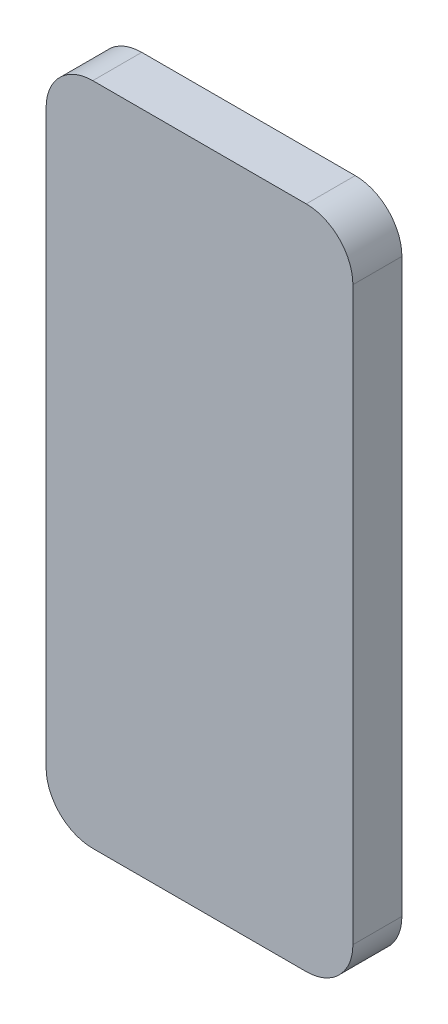
ISO-10303-21;
HEADER;
FILE_DESCRIPTION(('STEP AP214'),'2;1');
FILE_NAME('part.step','',(''),(''),'','','');
FILE_SCHEMA(('AUTOMOTIVE_DESIGN { 1 0 10303 214 1 1 1 1 }'));
ENDSEC;
DATA;
#1=APPLICATION_CONTEXT('core data for automotive mechanical design processes');
#2=APPLICATION_PROTOCOL_DEFINITION('international standard','automotive_design',2000,#1);
#3=PRODUCT_CONTEXT('',#1,'mechanical');
#4=PRODUCT('Part','Part','',(#3));
#5=PRODUCT_RELATED_PRODUCT_CATEGORY('part','',(#4));
#6=PRODUCT_DEFINITION_FORMATION('','',#4);
#7=PRODUCT_DEFINITION_CONTEXT('part definition',#1,'design');
#8=PRODUCT_DEFINITION('design','',#6,#7);
#9=PRODUCT_DEFINITION_SHAPE('','',#8);
#10=(LENGTH_UNIT() NAMED_UNIT(*) SI_UNIT(.MILLI.,.METRE.));
#11=(NAMED_UNIT(*) PLANE_ANGLE_UNIT() SI_UNIT($,.RADIAN.));
#12=(NAMED_UNIT(*) SI_UNIT($,.STERADIAN.) SOLID_ANGLE_UNIT());
#13=UNCERTAINTY_MEASURE_WITH_UNIT(LENGTH_MEASURE(1.E-05),#10,'distance_accuracy_value','');
#14=(GEOMETRIC_REPRESENTATION_CONTEXT(3) GLOBAL_UNCERTAINTY_ASSIGNED_CONTEXT((#13)) GLOBAL_UNIT_ASSIGNED_CONTEXT((#10,
#11,#12)) REPRESENTATION_CONTEXT('',''));
#15=CARTESIAN_POINT('',(0.,0.,0.));
#16=DIRECTION('',(0.,0.,1.));
#17=DIRECTION('',(1.,0.,0.));
#18=AXIS2_PLACEMENT_3D('',#15,#16,#17);
#19=CARTESIAN_POINT('',(19.725,42.75,6.3));
#20=DIRECTION('',(-1.,0.,0.));
#21=DIRECTION('',(0.,-1.,0.));
#22=AXIS2_PLACEMENT_3D('',#19,#20,#21);
#23=PLANE('',#22);
#24=DIRECTION('',(0.,1.,0.));
#25=VECTOR('',#24,1.);
#26=CARTESIAN_POINT('',(19.725,42.75,6.3));
#27=LINE('',#26,#25);
#28=CARTESIAN_POINT('',(19.725,-36.75,6.3));
#29=VERTEX_POINT('',#28);
#30=CARTESIAN_POINT('',(19.725,36.75,6.3));
#31=VERTEX_POINT('',#30);
#32=EDGE_CURVE('E127',#29,#31,#27,.T.);
#33=ORIENTED_EDGE('',*,*,#32,.F.);
#34=DIRECTION('',(0.,0.,-1.));
#35=VECTOR('',#34,1.);
#36=CARTESIAN_POINT('',(19.725,-36.75,6.3));
#37=LINE('',#36,#35);
#38=CARTESIAN_POINT('',(19.725,-36.75,0.));
#39=VERTEX_POINT('',#38);
#40=EDGE_CURVE('E111',#29,#39,#37,.T.);
#41=ORIENTED_EDGE('',*,*,#40,.T.);
#42=DIRECTION('',(0.,1.,0.));
#43=VECTOR('',#42,1.);
#44=CARTESIAN_POINT('',(19.725,42.75,0.));
#45=LINE('',#44,#43);
#46=CARTESIAN_POINT('',(19.725,36.75,0.));
#47=VERTEX_POINT('',#46);
#48=EDGE_CURVE('E124',#39,#47,#45,.T.);
#49=ORIENTED_EDGE('',*,*,#48,.T.);
#50=DIRECTION('',(0.,0.,-1.));
#51=VECTOR('',#50,1.);
#52=CARTESIAN_POINT('',(19.725,36.75,6.3));
#53=LINE('',#52,#51);
#54=EDGE_CURVE('E130',#47,#31,#53,.F.);
#55=ORIENTED_EDGE('',*,*,#54,.T.);
#56=EDGE_LOOP('',(#33,#41,#49,#55));
#57=FACE_BOUND('',#56,.T.);
#58=ADVANCED_FACE('F39',(#57),#23,.F.);
#59=CARTESIAN_POINT('',(-19.725,42.75,6.3));
#60=DIRECTION('',(0.,-1.,0.));
#61=DIRECTION('',(0.,0.,-1.));
#62=AXIS2_PLACEMENT_3D('',#59,#60,#61);
#63=PLANE('',#62);
#64=DIRECTION('',(-1.,0.,0.));
#65=VECTOR('',#64,1.);
#66=CARTESIAN_POINT('',(-19.725,42.75,0.));
#67=LINE('',#66,#65);
#68=CARTESIAN_POINT('',(13.725,42.75,0.));
#69=VERTEX_POINT('',#68);
#70=CARTESIAN_POINT('',(-13.725,42.75,0.));
#71=VERTEX_POINT('',#70);
#72=EDGE_CURVE('E135',#69,#71,#67,.T.);
#73=ORIENTED_EDGE('',*,*,#72,.T.);
#74=DIRECTION('',(0.,0.,-1.));
#75=VECTOR('',#74,1.);
#76=CARTESIAN_POINT('',(-13.725,42.75,6.3));
#77=LINE('',#76,#75);
#78=CARTESIAN_POINT('',(-13.725,42.75,6.3));
#79=VERTEX_POINT('',#78);
#80=EDGE_CURVE('E190',#71,#79,#77,.F.);
#81=ORIENTED_EDGE('',*,*,#80,.T.);
#82=DIRECTION('',(-1.,0.,0.));
#83=VECTOR('',#82,1.);
#84=CARTESIAN_POINT('',(-19.725,42.75,6.3));
#85=LINE('',#84,#83);
#86=CARTESIAN_POINT('',(13.725,42.75,6.3));
#87=VERTEX_POINT('',#86);
#88=EDGE_CURVE('E365',#87,#79,#85,.T.);
#89=ORIENTED_EDGE('',*,*,#88,.F.);
#90=DIRECTION('',(0.,0.,-1.));
#91=VECTOR('',#90,1.);
#92=CARTESIAN_POINT('',(13.725,42.75,6.3));
#93=LINE('',#92,#91);
#94=EDGE_CURVE('E186',#87,#69,#93,.T.);
#95=ORIENTED_EDGE('',*,*,#94,.T.);
#96=EDGE_LOOP('',(#73,#81,#89,#95));
#97=FACE_BOUND('',#96,.T.);
#98=ADVANCED_FACE('F334',(#97),#63,.F.);
#99=CARTESIAN_POINT('',(-19.725,42.75,6.3));
#100=DIRECTION('',(1.,0.,0.));
#101=DIRECTION('',(0.,1.,0.));
#102=AXIS2_PLACEMENT_3D('',#99,#100,#101);
#103=PLANE('',#102);
#104=DIRECTION('',(0.,-1.,0.));
#105=VECTOR('',#104,1.);
#106=CARTESIAN_POINT('',(-19.725,42.75,0.));
#107=LINE('',#106,#105);
#108=CARTESIAN_POINT('',(-19.725,36.75,0.));
#109=VERTEX_POINT('',#108);
#110=CARTESIAN_POINT('',(-19.725,-36.75,0.));
#111=VERTEX_POINT('',#110);
#112=EDGE_CURVE('E141',#109,#111,#107,.T.);
#113=ORIENTED_EDGE('',*,*,#112,.T.);
#114=DIRECTION('',(0.,0.,-1.));
#115=VECTOR('',#114,1.);
#116=CARTESIAN_POINT('',(-19.725,-36.75,6.3));
#117=LINE('',#116,#115);
#118=CARTESIAN_POINT('',(-19.725,-36.75,6.3));
#119=VERTEX_POINT('',#118);
#120=EDGE_CURVE('E55',#111,#119,#117,.F.);
#121=ORIENTED_EDGE('',*,*,#120,.T.);
#122=DIRECTION('',(0.,-1.,0.));
#123=VECTOR('',#122,1.);
#124=CARTESIAN_POINT('',(-19.725,42.75,6.3));
#125=LINE('',#124,#123);
#126=CARTESIAN_POINT('',(-19.725,36.75,6.3));
#127=VERTEX_POINT('',#126);
#128=EDGE_CURVE('E356',#127,#119,#125,.T.);
#129=ORIENTED_EDGE('',*,*,#128,.F.);
#130=DIRECTION('',(0.,0.,-1.));
#131=VECTOR('',#130,1.);
#132=CARTESIAN_POINT('',(-19.725,36.75,6.3));
#133=LINE('',#132,#131);
#134=EDGE_CURVE('E180',#127,#109,#133,.T.);
#135=ORIENTED_EDGE('',*,*,#134,.T.);
#136=EDGE_LOOP('',(#113,#121,#129,#135));
#137=FACE_BOUND('',#136,.T.);
#138=ADVANCED_FACE('F339',(#137),#103,.F.);
#139=CARTESIAN_POINT('',(-19.725,-42.75,6.3));
#140=DIRECTION('',(0.,1.,0.));
#141=DIRECTION('',(0.,0.,1.));
#142=AXIS2_PLACEMENT_3D('',#139,#140,#141);
#143=PLANE('',#142);
#144=DIRECTION('',(1.,0.,0.));
#145=VECTOR('',#144,1.);
#146=CARTESIAN_POINT('',(-19.725,-42.75,0.));
#147=LINE('',#146,#145);
#148=CARTESIAN_POINT('',(-13.725,-42.75,0.));
#149=VERTEX_POINT('',#148);
#150=CARTESIAN_POINT('',(13.725,-42.75,0.));
#151=VERTEX_POINT('',#150);
#152=EDGE_CURVE('E152',#149,#151,#147,.T.);
#153=ORIENTED_EDGE('',*,*,#152,.T.);
#154=DIRECTION('',(0.,0.,-1.));
#155=VECTOR('',#154,1.);
#156=CARTESIAN_POINT('',(13.725,-42.75,6.3));
#157=LINE('',#156,#155);
#158=CARTESIAN_POINT('',(13.725,-42.75,6.3));
#159=VERTEX_POINT('',#158);
#160=EDGE_CURVE('E112',#151,#159,#157,.F.);
#161=ORIENTED_EDGE('',*,*,#160,.T.);
#162=DIRECTION('',(1.,0.,0.));
#163=VECTOR('',#162,1.);
#164=CARTESIAN_POINT('',(-19.725,-42.75,6.3));
#165=LINE('',#164,#163);
#166=CARTESIAN_POINT('',(-13.725,-42.75,6.3));
#167=VERTEX_POINT('',#166);
#168=EDGE_CURVE('E147',#167,#159,#165,.T.);
#169=ORIENTED_EDGE('',*,*,#168,.F.);
#170=DIRECTION('',(0.,0.,-1.));
#171=VECTOR('',#170,1.);
#172=CARTESIAN_POINT('',(-13.725,-42.75,6.3));
#173=LINE('',#172,#171);
#174=EDGE_CURVE('E118',#167,#149,#173,.T.);
#175=ORIENTED_EDGE('',*,*,#174,.T.);
#176=EDGE_LOOP('',(#153,#161,#169,#175));
#177=FACE_BOUND('',#176,.T.);
#178=ADVANCED_FACE('F361',(#177),#143,.F.);
#179=CARTESIAN_POINT('',(0.,0.,6.3));
#180=DIRECTION('',(0.,0.,1.));
#181=DIRECTION('',(1.,0.,0.));
#182=AXIS2_PLACEMENT_3D('',#179,#180,#181);
#183=PLANE('',#182);
#184=ORIENTED_EDGE('',*,*,#168,.T.);
#185=CARTESIAN_POINT('',(13.725,-36.75,6.3));
#186=DIRECTION('',(0.,0.,1.));
#187=DIRECTION('',(1.,0.,0.));
#188=AXIS2_PLACEMENT_3D('',#185,#186,#187);
#189=CIRCLE('',#188,6.);
#190=EDGE_CURVE('E177',#159,#29,#189,.T.);
#191=ORIENTED_EDGE('',*,*,#190,.T.);
#192=ORIENTED_EDGE('',*,*,#32,.T.);
#193=CARTESIAN_POINT('',(13.725,36.75,6.3));
#194=DIRECTION('',(0.,0.,1.));
#195=DIRECTION('',(1.,0.,0.));
#196=AXIS2_PLACEMENT_3D('',#193,#194,#195);
#197=CIRCLE('',#196,6.);
#198=EDGE_CURVE('E169',#31,#87,#197,.T.);
#199=ORIENTED_EDGE('',*,*,#198,.T.);
#200=ORIENTED_EDGE('',*,*,#88,.T.);
#201=CARTESIAN_POINT('',(-13.725,36.75,6.3));
#202=DIRECTION('',(0.,0.,1.));
#203=DIRECTION('',(1.,0.,0.));
#204=AXIS2_PLACEMENT_3D('',#201,#202,#203);
#205=CIRCLE('',#204,6.);
#206=EDGE_CURVE('E62',#79,#127,#205,.T.);
#207=ORIENTED_EDGE('',*,*,#206,.T.);
#208=ORIENTED_EDGE('',*,*,#128,.T.);
#209=CARTESIAN_POINT('',(-13.725,-36.75,6.3));
#210=DIRECTION('',(0.,0.,1.));
#211=DIRECTION('',(1.,0.,0.));
#212=AXIS2_PLACEMENT_3D('',#209,#210,#211);
#213=CIRCLE('',#212,6.);
#214=EDGE_CURVE('E174',#119,#167,#213,.T.);
#215=ORIENTED_EDGE('',*,*,#214,.T.);
#216=EDGE_LOOP('',(#184,#191,#192,#199,#200,#207,#208,#215));
#217=FACE_BOUND('',#216,.T.);
#218=ADVANCED_FACE('F276',(#217),#183,.T.);
#219=CARTESIAN_POINT('',(0.,0.,0.));
#220=DIRECTION('',(0.,0.,1.));
#221=DIRECTION('',(1.,0.,0.));
#222=AXIS2_PLACEMENT_3D('',#219,#220,#221);
#223=PLANE('',#222);
#224=CARTESIAN_POINT('',(0.,-27.75,0.));
#225=DIRECTION('',(0.,0.,1.));
#226=DIRECTION('',(1.,0.,0.));
#227=AXIS2_PLACEMENT_3D('',#224,#225,#226);
#228=CIRCLE('',#227,4.25);
#229=CARTESIAN_POINT('',(4.25000000000001,-27.75,0.));
#230=VERTEX_POINT('',#229);
#231=EDGE_CURVE('E11',#230,#230,#228,.F.);
#232=ORIENTED_EDGE('',*,*,#231,.F.);
#233=EDGE_LOOP('',(#232));
#234=FACE_BOUND('',#233,.T.);
#235=CARTESIAN_POINT('',(-11.225,-27.75,0.));
#236=DIRECTION('',(0.,0.,1.));
#237=DIRECTION('',(1.,0.,0.));
#238=AXIS2_PLACEMENT_3D('',#235,#236,#237);
#239=CIRCLE('',#238,4.25);
#240=CARTESIAN_POINT('',(-6.975,-27.75,0.));
#241=VERTEX_POINT('',#240);
#242=EDGE_CURVE('E48',#241,#241,#239,.F.);
#243=ORIENTED_EDGE('',*,*,#242,.F.);
#244=EDGE_LOOP('',(#243));
#245=FACE_BOUND('',#244,.T.);
#246=CARTESIAN_POINT('',(11.225,-27.75,0.));
#247=DIRECTION('',(0.,0.,1.));
#248=DIRECTION('',(1.,0.,0.));
#249=AXIS2_PLACEMENT_3D('',#246,#247,#248);
#250=CIRCLE('',#249,4.25);
#251=CARTESIAN_POINT('',(15.475,-27.75,0.));
#252=VERTEX_POINT('',#251);
#253=EDGE_CURVE('E265',#252,#252,#250,.F.);
#254=ORIENTED_EDGE('',*,*,#253,.F.);
#255=EDGE_LOOP('',(#254));
#256=FACE_BOUND('',#255,.T.);
#257=CARTESIAN_POINT('',(0.,-17.75,0.));
#258=DIRECTION('',(0.,0.,1.));
#259=DIRECTION('',(1.,0.,0.));
#260=AXIS2_PLACEMENT_3D('',#257,#258,#259);
#261=CIRCLE('',#260,4.25);
#262=CARTESIAN_POINT('',(4.25000000000001,-17.75,0.));
#263=VERTEX_POINT('',#262);
#264=EDGE_CURVE('E261',#263,#263,#261,.F.);
#265=ORIENTED_EDGE('',*,*,#264,.F.);
#266=EDGE_LOOP('',(#265));
#267=FACE_BOUND('',#266,.T.);
#268=CARTESIAN_POINT('',(-11.225,-17.75,0.));
#269=DIRECTION('',(0.,0.,1.));
#270=DIRECTION('',(1.,0.,0.));
#271=AXIS2_PLACEMENT_3D('',#268,#269,#270);
#272=CIRCLE('',#271,4.25);
#273=CARTESIAN_POINT('',(-6.975,-17.75,0.));
#274=VERTEX_POINT('',#273);
#275=EDGE_CURVE('E257',#274,#274,#272,.F.);
#276=ORIENTED_EDGE('',*,*,#275,.F.);
#277=EDGE_LOOP('',(#276));
#278=FACE_BOUND('',#277,.T.);
#279=CARTESIAN_POINT('',(11.225,-17.75,0.));
#280=DIRECTION('',(0.,0.,1.));
#281=DIRECTION('',(1.,0.,0.));
#282=AXIS2_PLACEMENT_3D('',#279,#280,#281);
#283=CIRCLE('',#282,4.25);
#284=CARTESIAN_POINT('',(15.475,-17.75,0.));
#285=VERTEX_POINT('',#284);
#286=EDGE_CURVE('E253',#285,#285,#283,.F.);
#287=ORIENTED_EDGE('',*,*,#286,.F.);
#288=EDGE_LOOP('',(#287));
#289=FACE_BOUND('',#288,.T.);
#290=CARTESIAN_POINT('',(0.,-7.75000000000005,0.));
#291=DIRECTION('',(0.,0.,1.));
#292=DIRECTION('',(1.,0.,0.));
#293=AXIS2_PLACEMENT_3D('',#290,#291,#292);
#294=CIRCLE('',#293,4.25);
#295=CARTESIAN_POINT('',(4.25000000000001,-7.75000000000005,0.));
#296=VERTEX_POINT('',#295);
#297=EDGE_CURVE('E249',#296,#296,#294,.F.);
#298=ORIENTED_EDGE('',*,*,#297,.F.);
#299=EDGE_LOOP('',(#298));
#300=FACE_BOUND('',#299,.T.);
#301=CARTESIAN_POINT('',(-11.225,-7.75,0.));
#302=DIRECTION('',(0.,0.,1.));
#303=DIRECTION('',(1.,0.,0.));
#304=AXIS2_PLACEMENT_3D('',#301,#302,#303);
#305=CIRCLE('',#304,4.25);
#306=CARTESIAN_POINT('',(-6.975,-7.75,0.));
#307=VERTEX_POINT('',#306);
#308=EDGE_CURVE('E245',#307,#307,#305,.F.);
#309=ORIENTED_EDGE('',*,*,#308,.F.);
#310=EDGE_LOOP('',(#309));
#311=FACE_BOUND('',#310,.T.);
#312=CARTESIAN_POINT('',(11.225,-7.75,0.));
#313=DIRECTION('',(0.,0.,1.));
#314=DIRECTION('',(1.,0.,0.));
#315=AXIS2_PLACEMENT_3D('',#312,#313,#314);
#316=CIRCLE('',#315,4.25);
#317=CARTESIAN_POINT('',(15.475,-7.75,0.));
#318=VERTEX_POINT('',#317);
#319=EDGE_CURVE('E241',#318,#318,#316,.F.);
#320=ORIENTED_EDGE('',*,*,#319,.F.);
#321=EDGE_LOOP('',(#320));
#322=FACE_BOUND('',#321,.T.);
#323=CARTESIAN_POINT('',(0.,2.24999999999995,0.));
#324=DIRECTION('',(0.,0.,1.));
#325=DIRECTION('',(1.,0.,0.));
#326=AXIS2_PLACEMENT_3D('',#323,#324,#325);
#327=CIRCLE('',#326,4.25);
#328=CARTESIAN_POINT('',(4.25000000000001,2.24999999999995,0.));
#329=VERTEX_POINT('',#328);
#330=EDGE_CURVE('E237',#329,#329,#327,.F.);
#331=ORIENTED_EDGE('',*,*,#330,.F.);
#332=EDGE_LOOP('',(#331));
#333=FACE_BOUND('',#332,.T.);
#334=CARTESIAN_POINT('',(-11.225,2.25,0.));
#335=DIRECTION('',(0.,0.,1.));
#336=DIRECTION('',(1.,0.,0.));
#337=AXIS2_PLACEMENT_3D('',#334,#335,#336);
#338=CIRCLE('',#337,4.25);
#339=CARTESIAN_POINT('',(-6.975,2.25,0.));
#340=VERTEX_POINT('',#339);
#341=EDGE_CURVE('E233',#340,#340,#338,.F.);
#342=ORIENTED_EDGE('',*,*,#341,.F.);
#343=EDGE_LOOP('',(#342));
#344=FACE_BOUND('',#343,.T.);
#345=CARTESIAN_POINT('',(11.225,2.25,0.));
#346=DIRECTION('',(0.,0.,1.));
#347=DIRECTION('',(1.,0.,0.));
#348=AXIS2_PLACEMENT_3D('',#345,#346,#347);
#349=CIRCLE('',#348,4.25);
#350=CARTESIAN_POINT('',(15.475,2.25,0.));
#351=VERTEX_POINT('',#350);
#352=EDGE_CURVE('E229',#351,#351,#349,.F.);
#353=ORIENTED_EDGE('',*,*,#352,.F.);
#354=EDGE_LOOP('',(#353));
#355=FACE_BOUND('',#354,.T.);
#356=CARTESIAN_POINT('',(0.,12.25,0.));
#357=DIRECTION('',(0.,0.,1.));
#358=DIRECTION('',(1.,0.,0.));
#359=AXIS2_PLACEMENT_3D('',#356,#357,#358);
#360=CIRCLE('',#359,4.25);
#361=CARTESIAN_POINT('',(4.25,12.25,0.));
#362=VERTEX_POINT('',#361);
#363=EDGE_CURVE('E225',#362,#362,#360,.F.);
#364=ORIENTED_EDGE('',*,*,#363,.F.);
#365=EDGE_LOOP('',(#364));
#366=FACE_BOUND('',#365,.T.);
#367=CARTESIAN_POINT('',(-11.225,12.25,0.));
#368=DIRECTION('',(0.,0.,1.));
#369=DIRECTION('',(1.,0.,0.));
#370=AXIS2_PLACEMENT_3D('',#367,#368,#369);
#371=CIRCLE('',#370,4.25);
#372=CARTESIAN_POINT('',(-6.975,12.25,0.));
#373=VERTEX_POINT('',#372);
#374=EDGE_CURVE('E221',#373,#373,#371,.F.);
#375=ORIENTED_EDGE('',*,*,#374,.F.);
#376=EDGE_LOOP('',(#375));
#377=FACE_BOUND('',#376,.T.);
#378=CARTESIAN_POINT('',(11.225,12.25,0.));
#379=DIRECTION('',(0.,0.,1.));
#380=DIRECTION('',(1.,0.,0.));
#381=AXIS2_PLACEMENT_3D('',#378,#379,#380);
#382=CIRCLE('',#381,4.25);
#383=CARTESIAN_POINT('',(15.475,12.25,0.));
#384=VERTEX_POINT('',#383);
#385=EDGE_CURVE('E217',#384,#384,#382,.F.);
#386=ORIENTED_EDGE('',*,*,#385,.F.);
#387=EDGE_LOOP('',(#386));
#388=FACE_BOUND('',#387,.T.);
#389=CARTESIAN_POINT('',(0.,22.25,0.));
#390=DIRECTION('',(0.,0.,1.));
#391=DIRECTION('',(1.,0.,0.));
#392=AXIS2_PLACEMENT_3D('',#389,#390,#391);
#393=CIRCLE('',#392,4.25);
#394=CARTESIAN_POINT('',(4.25,22.25,0.));
#395=VERTEX_POINT('',#394);
#396=EDGE_CURVE('E213',#395,#395,#393,.F.);
#397=ORIENTED_EDGE('',*,*,#396,.F.);
#398=EDGE_LOOP('',(#397));
#399=FACE_BOUND('',#398,.T.);
#400=CARTESIAN_POINT('',(-11.225,22.25,0.));
#401=DIRECTION('',(0.,0.,1.));
#402=DIRECTION('',(1.,0.,0.));
#403=AXIS2_PLACEMENT_3D('',#400,#401,#402);
#404=CIRCLE('',#403,4.25);
#405=CARTESIAN_POINT('',(-6.97500000000001,22.25,0.));
#406=VERTEX_POINT('',#405);
#407=EDGE_CURVE('E209',#406,#406,#404,.F.);
#408=ORIENTED_EDGE('',*,*,#407,.F.);
#409=EDGE_LOOP('',(#408));
#410=FACE_BOUND('',#409,.T.);
#411=CARTESIAN_POINT('',(11.225,22.25,0.));
#412=DIRECTION('',(0.,0.,1.));
#413=DIRECTION('',(1.,0.,0.));
#414=AXIS2_PLACEMENT_3D('',#411,#412,#413);
#415=CIRCLE('',#414,4.25);
#416=CARTESIAN_POINT('',(15.475,22.25,0.));
#417=VERTEX_POINT('',#416);
#418=EDGE_CURVE('E205',#417,#417,#415,.F.);
#419=ORIENTED_EDGE('',*,*,#418,.F.);
#420=EDGE_LOOP('',(#419));
#421=FACE_BOUND('',#420,.T.);
#422=CARTESIAN_POINT('',(0.,32.25,0.));
#423=DIRECTION('',(0.,0.,1.));
#424=DIRECTION('',(1.,0.,0.));
#425=AXIS2_PLACEMENT_3D('',#422,#423,#424);
#426=CIRCLE('',#425,4.25);
#427=CARTESIAN_POINT('',(4.25,32.25,0.));
#428=VERTEX_POINT('',#427);
#429=EDGE_CURVE('E201',#428,#428,#426,.F.);
#430=ORIENTED_EDGE('',*,*,#429,.F.);
#431=EDGE_LOOP('',(#430));
#432=FACE_BOUND('',#431,.T.);
#433=CARTESIAN_POINT('',(-11.225,32.25,0.));
#434=DIRECTION('',(0.,0.,1.));
#435=DIRECTION('',(1.,0.,0.));
#436=AXIS2_PLACEMENT_3D('',#433,#434,#435);
#437=CIRCLE('',#436,4.25);
#438=CARTESIAN_POINT('',(-6.97500000000001,32.25,0.));
#439=VERTEX_POINT('',#438);
#440=EDGE_CURVE('E197',#439,#439,#437,.F.);
#441=ORIENTED_EDGE('',*,*,#440,.F.);
#442=EDGE_LOOP('',(#441));
#443=FACE_BOUND('',#442,.T.);
#444=CARTESIAN_POINT('',(11.225,32.25,0.));
#445=DIRECTION('',(0.,0.,1.));
#446=DIRECTION('',(1.,0.,0.));
#447=AXIS2_PLACEMENT_3D('',#444,#445,#446);
#448=CIRCLE('',#447,4.25);
#449=CARTESIAN_POINT('',(15.475,32.25,0.));
#450=VERTEX_POINT('',#449);
#451=EDGE_CURVE('E193',#450,#450,#448,.F.);
#452=ORIENTED_EDGE('',*,*,#451,.F.);
#453=EDGE_LOOP('',(#452));
#454=FACE_BOUND('',#453,.T.);
#455=ORIENTED_EDGE('',*,*,#48,.F.);
#456=CARTESIAN_POINT('',(13.725,-36.75,0.));
#457=DIRECTION('',(0.,0.,1.));
#458=DIRECTION('',(1.,0.,0.));
#459=AXIS2_PLACEMENT_3D('',#456,#457,#458);
#460=CIRCLE('',#459,6.);
#461=EDGE_CURVE('E107',#39,#151,#460,.F.);
#462=ORIENTED_EDGE('',*,*,#461,.T.);
#463=ORIENTED_EDGE('',*,*,#152,.F.);
#464=CARTESIAN_POINT('',(-13.725,-36.75,0.));
#465=DIRECTION('',(0.,0.,1.));
#466=DIRECTION('',(1.,0.,0.));
#467=AXIS2_PLACEMENT_3D('',#464,#465,#466);
#468=CIRCLE('',#467,6.);
#469=EDGE_CURVE('E119',#149,#111,#468,.F.);
#470=ORIENTED_EDGE('',*,*,#469,.T.);
#471=ORIENTED_EDGE('',*,*,#112,.F.);
#472=CARTESIAN_POINT('',(-13.725,36.75,0.));
#473=DIRECTION('',(0.,0.,1.));
#474=DIRECTION('',(1.,0.,0.));
#475=AXIS2_PLACEMENT_3D('',#472,#473,#474);
#476=CIRCLE('',#475,6.);
#477=EDGE_CURVE('E159',#109,#71,#476,.F.);
#478=ORIENTED_EDGE('',*,*,#477,.T.);
#479=ORIENTED_EDGE('',*,*,#72,.F.);
#480=CARTESIAN_POINT('',(13.725,36.75,0.));
#481=DIRECTION('',(0.,0.,1.));
#482=DIRECTION('',(1.,0.,0.));
#483=AXIS2_PLACEMENT_3D('',#480,#481,#482);
#484=CIRCLE('',#483,6.);
#485=EDGE_CURVE('E129',#69,#47,#484,.F.);
#486=ORIENTED_EDGE('',*,*,#485,.T.);
#487=EDGE_LOOP('',(#455,#462,#463,#470,#471,#478,#479,#486));
#488=FACE_BOUND('',#487,.T.);
#489=ADVANCED_FACE('F132',(#234,#245,#256,#267,#278,#289,#300,#311,#322,#333,#344,#355,#366,
#377,#388,#399,#410,#421,#432,#443,#454,#488),#223,.F.);
#490=CARTESIAN_POINT('',(13.725,-36.75,6.3));
#491=DIRECTION('',(0.,0.,-1.));
#492=DIRECTION('',(-1.,0.,0.));
#493=AXIS2_PLACEMENT_3D('',#490,#491,#492);
#494=CYLINDRICAL_SURFACE('',#493,6.);
#495=ORIENTED_EDGE('',*,*,#190,.F.);
#496=ORIENTED_EDGE('',*,*,#160,.F.);
#497=ORIENTED_EDGE('',*,*,#461,.F.);
#498=ORIENTED_EDGE('',*,*,#40,.F.);
#499=EDGE_LOOP('',(#495,#496,#497,#498));
#500=FACE_BOUND('',#499,.T.);
#501=ADVANCED_FACE('F110',(#500),#494,.T.);
#502=CARTESIAN_POINT('',(-13.725,-36.75,6.3));
#503=DIRECTION('',(0.,0.,-1.));
#504=DIRECTION('',(-1.,0.,0.));
#505=AXIS2_PLACEMENT_3D('',#502,#503,#504);
#506=CYLINDRICAL_SURFACE('',#505,6.);
#507=ORIENTED_EDGE('',*,*,#214,.F.);
#508=ORIENTED_EDGE('',*,*,#120,.F.);
#509=ORIENTED_EDGE('',*,*,#469,.F.);
#510=ORIENTED_EDGE('',*,*,#174,.F.);
#511=EDGE_LOOP('',(#507,#508,#509,#510));
#512=FACE_BOUND('',#511,.T.);
#513=ADVANCED_FACE('F346',(#512),#506,.T.);
#514=CARTESIAN_POINT('',(-13.725,36.75,6.3));
#515=DIRECTION('',(0.,0.,-1.));
#516=DIRECTION('',(-1.,0.,0.));
#517=AXIS2_PLACEMENT_3D('',#514,#515,#516);
#518=CYLINDRICAL_SURFACE('',#517,6.);
#519=ORIENTED_EDGE('',*,*,#206,.F.);
#520=ORIENTED_EDGE('',*,*,#80,.F.);
#521=ORIENTED_EDGE('',*,*,#477,.F.);
#522=ORIENTED_EDGE('',*,*,#134,.F.);
#523=EDGE_LOOP('',(#519,#520,#521,#522));
#524=FACE_BOUND('',#523,.T.);
#525=ADVANCED_FACE('F329',(#524),#518,.T.);
#526=CARTESIAN_POINT('',(13.725,36.75,6.3));
#527=DIRECTION('',(0.,0.,-1.));
#528=DIRECTION('',(-1.,0.,0.));
#529=AXIS2_PLACEMENT_3D('',#526,#527,#528);
#530=CYLINDRICAL_SURFACE('',#529,6.);
#531=ORIENTED_EDGE('',*,*,#198,.F.);
#532=ORIENTED_EDGE('',*,*,#54,.F.);
#533=ORIENTED_EDGE('',*,*,#485,.F.);
#534=ORIENTED_EDGE('',*,*,#94,.F.);
#535=EDGE_LOOP('',(#531,#532,#533,#534));
#536=FACE_BOUND('',#535,.T.);
#537=ADVANCED_FACE('F41',(#536),#530,.T.);
#538=CARTESIAN_POINT('',(11.225,32.25,-0.5));
#539=DIRECTION('',(0.,0.,1.));
#540=DIRECTION('',(1.,0.,0.));
#541=AXIS2_PLACEMENT_3D('',#538,#539,#540);
#542=CYLINDRICAL_SURFACE('',#541,4.25);
#543=CARTESIAN_POINT('',(11.225,32.25,-0.5));
#544=DIRECTION('',(0.,0.,-1.));
#545=DIRECTION('',(-1.,0.,0.));
#546=AXIS2_PLACEMENT_3D('',#543,#544,#545);
#547=CIRCLE('',#546,4.25);
#548=CARTESIAN_POINT('',(6.97500000000001,32.25,-0.5));
#549=VERTEX_POINT('',#548);
#550=EDGE_CURVE('E136',#549,#549,#547,.T.);
#551=ORIENTED_EDGE('',*,*,#550,.F.);
#552=EDGE_LOOP('',(#551));
#553=FACE_BOUND('',#552,.T.);
#554=ORIENTED_EDGE('',*,*,#451,.T.);
#555=EDGE_LOOP('',(#554));
#556=FACE_BOUND('',#555,.T.);
#557=ADVANCED_FACE('F317',(#553,#556),#542,.T.);
#558=CARTESIAN_POINT('',(11.225,32.25,-0.5));
#559=DIRECTION('',(0.,0.,-1.));
#560=DIRECTION('',(-1.,0.,0.));
#561=AXIS2_PLACEMENT_3D('',#558,#559,#560);
#562=PLANE('',#561);
#563=ORIENTED_EDGE('',*,*,#550,.T.);
#564=EDGE_LOOP('',(#563));
#565=FACE_BOUND('',#564,.T.);
#566=ADVANCED_FACE('F319',(#565),#562,.T.);
#567=CARTESIAN_POINT('',(-11.225,32.25,-0.5));
#568=DIRECTION('',(0.,0.,1.));
#569=DIRECTION('',(1.,0.,0.));
#570=AXIS2_PLACEMENT_3D('',#567,#568,#569);
#571=CYLINDRICAL_SURFACE('',#570,4.25);
#572=CARTESIAN_POINT('',(-11.225,32.25,-0.5));
#573=DIRECTION('',(0.,0.,-1.));
#574=DIRECTION('',(1.,0.,0.));
#575=AXIS2_PLACEMENT_3D('',#572,#573,#574);
#576=CIRCLE('',#575,4.25);
#577=CARTESIAN_POINT('',(-6.97500000000001,32.25,-0.5));
#578=VERTEX_POINT('',#577);
#579=EDGE_CURVE('E144',#578,#578,#576,.T.);
#580=ORIENTED_EDGE('',*,*,#579,.F.);
#581=EDGE_LOOP('',(#580));
#582=FACE_BOUND('',#581,.T.);
#583=ORIENTED_EDGE('',*,*,#440,.T.);
#584=EDGE_LOOP('',(#583));
#585=FACE_BOUND('',#584,.T.);
#586=ADVANCED_FACE('F326',(#582,#585),#571,.T.);
#587=CARTESIAN_POINT('',(-11.225,32.25,-0.5));
#588=DIRECTION('',(0.,0.,1.));
#589=DIRECTION('',(1.,0.,0.));
#590=AXIS2_PLACEMENT_3D('',#587,#588,#589);
#591=PLANE('',#590);
#592=ORIENTED_EDGE('',*,*,#579,.T.);
#593=EDGE_LOOP('',(#592));
#594=FACE_BOUND('',#593,.T.);
#595=ADVANCED_FACE('F605',(#594),#591,.F.);
#596=CARTESIAN_POINT('',(0.,32.25,-0.5));
#597=DIRECTION('',(0.,0.,1.));
#598=DIRECTION('',(1.,0.,0.));
#599=AXIS2_PLACEMENT_3D('',#596,#597,#598);
#600=CYLINDRICAL_SURFACE('',#599,4.25);
#601=CARTESIAN_POINT('',(0.,32.25,-0.5));
#602=DIRECTION('',(0.,0.,-1.));
#603=DIRECTION('',(-1.,0.,0.));
#604=AXIS2_PLACEMENT_3D('',#601,#602,#603);
#605=CIRCLE('',#604,4.25);
#606=CARTESIAN_POINT('',(-4.25,32.25,-0.5));
#607=VERTEX_POINT('',#606);
#608=EDGE_CURVE('E374',#607,#607,#605,.T.);
#609=ORIENTED_EDGE('',*,*,#608,.F.);
#610=EDGE_LOOP('',(#609));
#611=FACE_BOUND('',#610,.T.);
#612=ORIENTED_EDGE('',*,*,#429,.T.);
#613=EDGE_LOOP('',(#612));
#614=FACE_BOUND('',#613,.T.);
#615=ADVANCED_FACE('F601',(#611,#614),#600,.T.);
#616=CARTESIAN_POINT('',(0.,32.25,-0.5));
#617=DIRECTION('',(0.,0.,-1.));
#618=DIRECTION('',(-1.,0.,0.));
#619=AXIS2_PLACEMENT_3D('',#616,#617,#618);
#620=PLANE('',#619);
#621=ORIENTED_EDGE('',*,*,#608,.T.);
#622=EDGE_LOOP('',(#621));
#623=FACE_BOUND('',#622,.T.);
#624=ADVANCED_FACE('F597',(#623),#620,.T.);
#625=CARTESIAN_POINT('',(11.225,22.25,-0.5));
#626=DIRECTION('',(0.,0.,1.));
#627=DIRECTION('',(1.,0.,0.));
#628=AXIS2_PLACEMENT_3D('',#625,#626,#627);
#629=CYLINDRICAL_SURFACE('',#628,4.25);
#630=CARTESIAN_POINT('',(11.225,22.25,-0.5));
#631=DIRECTION('',(0.,0.,-1.));
#632=DIRECTION('',(-1.,0.,0.));
#633=AXIS2_PLACEMENT_3D('',#630,#631,#632);
#634=CIRCLE('',#633,4.25);
#635=CARTESIAN_POINT('',(6.97500000000001,22.25,-0.5));
#636=VERTEX_POINT('',#635);
#637=EDGE_CURVE('E378',#636,#636,#634,.T.);
#638=ORIENTED_EDGE('',*,*,#637,.F.);
#639=EDGE_LOOP('',(#638));
#640=FACE_BOUND('',#639,.T.);
#641=ORIENTED_EDGE('',*,*,#418,.T.);
#642=EDGE_LOOP('',(#641));
#643=FACE_BOUND('',#642,.T.);
#644=ADVANCED_FACE('F593',(#640,#643),#629,.T.);
#645=CARTESIAN_POINT('',(11.225,22.25,-0.5));
#646=DIRECTION('',(0.,0.,-1.));
#647=DIRECTION('',(-1.,0.,0.));
#648=AXIS2_PLACEMENT_3D('',#645,#646,#647);
#649=PLANE('',#648);
#650=ORIENTED_EDGE('',*,*,#637,.T.);
#651=EDGE_LOOP('',(#650));
#652=FACE_BOUND('',#651,.T.);
#653=ADVANCED_FACE('F589',(#652),#649,.T.);
#654=CARTESIAN_POINT('',(-11.225,22.25,-0.5));
#655=DIRECTION('',(0.,0.,1.));
#656=DIRECTION('',(1.,0.,0.));
#657=AXIS2_PLACEMENT_3D('',#654,#655,#656);
#658=CYLINDRICAL_SURFACE('',#657,4.25);
#659=CARTESIAN_POINT('',(-11.225,22.25,-0.5));
#660=DIRECTION('',(0.,0.,-1.));
#661=DIRECTION('',(1.,0.,0.));
#662=AXIS2_PLACEMENT_3D('',#659,#660,#661);
#663=CIRCLE('',#662,4.25);
#664=CARTESIAN_POINT('',(-6.97500000000001,22.25,-0.5));
#665=VERTEX_POINT('',#664);
#666=EDGE_CURVE('E382',#665,#665,#663,.T.);
#667=ORIENTED_EDGE('',*,*,#666,.F.);
#668=EDGE_LOOP('',(#667));
#669=FACE_BOUND('',#668,.T.);
#670=ORIENTED_EDGE('',*,*,#407,.T.);
#671=EDGE_LOOP('',(#670));
#672=FACE_BOUND('',#671,.T.);
#673=ADVANCED_FACE('F585',(#669,#672),#658,.T.);
#674=CARTESIAN_POINT('',(-11.225,22.25,-0.5));
#675=DIRECTION('',(0.,0.,1.));
#676=DIRECTION('',(1.,0.,0.));
#677=AXIS2_PLACEMENT_3D('',#674,#675,#676);
#678=PLANE('',#677);
#679=ORIENTED_EDGE('',*,*,#666,.T.);
#680=EDGE_LOOP('',(#679));
#681=FACE_BOUND('',#680,.T.);
#682=ADVANCED_FACE('F581',(#681),#678,.F.);
#683=CARTESIAN_POINT('',(0.,22.25,-0.5));
#684=DIRECTION('',(0.,0.,1.));
#685=DIRECTION('',(1.,0.,0.));
#686=AXIS2_PLACEMENT_3D('',#683,#684,#685);
#687=CYLINDRICAL_SURFACE('',#686,4.25);
#688=CARTESIAN_POINT('',(0.,22.25,-0.5));
#689=DIRECTION('',(0.,0.,-1.));
#690=DIRECTION('',(-1.,0.,0.));
#691=AXIS2_PLACEMENT_3D('',#688,#689,#690);
#692=CIRCLE('',#691,4.25);
#693=CARTESIAN_POINT('',(-4.25,22.25,-0.5));
#694=VERTEX_POINT('',#693);
#695=EDGE_CURVE('E386',#694,#694,#692,.T.);
#696=ORIENTED_EDGE('',*,*,#695,.F.);
#697=EDGE_LOOP('',(#696));
#698=FACE_BOUND('',#697,.T.);
#699=ORIENTED_EDGE('',*,*,#396,.T.);
#700=EDGE_LOOP('',(#699));
#701=FACE_BOUND('',#700,.T.);
#702=ADVANCED_FACE('F577',(#698,#701),#687,.T.);
#703=CARTESIAN_POINT('',(0.,22.25,-0.5));
#704=DIRECTION('',(0.,0.,-1.));
#705=DIRECTION('',(-1.,0.,0.));
#706=AXIS2_PLACEMENT_3D('',#703,#704,#705);
#707=PLANE('',#706);
#708=ORIENTED_EDGE('',*,*,#695,.T.);
#709=EDGE_LOOP('',(#708));
#710=FACE_BOUND('',#709,.T.);
#711=ADVANCED_FACE('F573',(#710),#707,.T.);
#712=CARTESIAN_POINT('',(11.225,12.25,-0.5));
#713=DIRECTION('',(0.,0.,1.));
#714=DIRECTION('',(1.,0.,0.));
#715=AXIS2_PLACEMENT_3D('',#712,#713,#714);
#716=CYLINDRICAL_SURFACE('',#715,4.25);
#717=CARTESIAN_POINT('',(11.225,12.25,-0.5));
#718=DIRECTION('',(0.,0.,-1.));
#719=DIRECTION('',(-1.,0.,0.));
#720=AXIS2_PLACEMENT_3D('',#717,#718,#719);
#721=CIRCLE('',#720,4.25);
#722=CARTESIAN_POINT('',(6.97500000000001,12.25,-0.5));
#723=VERTEX_POINT('',#722);
#724=EDGE_CURVE('E390',#723,#723,#721,.T.);
#725=ORIENTED_EDGE('',*,*,#724,.F.);
#726=EDGE_LOOP('',(#725));
#727=FACE_BOUND('',#726,.T.);
#728=ORIENTED_EDGE('',*,*,#385,.T.);
#729=EDGE_LOOP('',(#728));
#730=FACE_BOUND('',#729,.T.);
#731=ADVANCED_FACE('F569',(#727,#730),#716,.T.);
#732=CARTESIAN_POINT('',(11.225,12.25,-0.5));
#733=DIRECTION('',(0.,0.,-1.));
#734=DIRECTION('',(-1.,0.,0.));
#735=AXIS2_PLACEMENT_3D('',#732,#733,#734);
#736=PLANE('',#735);
#737=ORIENTED_EDGE('',*,*,#724,.T.);
#738=EDGE_LOOP('',(#737));
#739=FACE_BOUND('',#738,.T.);
#740=ADVANCED_FACE('F565',(#739),#736,.T.);
#741=CARTESIAN_POINT('',(-11.225,12.25,-0.5));
#742=DIRECTION('',(0.,0.,1.));
#743=DIRECTION('',(1.,0.,0.));
#744=AXIS2_PLACEMENT_3D('',#741,#742,#743);
#745=CYLINDRICAL_SURFACE('',#744,4.25);
#746=CARTESIAN_POINT('',(-11.225,12.25,-0.5));
#747=DIRECTION('',(0.,0.,-1.));
#748=DIRECTION('',(1.,0.,0.));
#749=AXIS2_PLACEMENT_3D('',#746,#747,#748);
#750=CIRCLE('',#749,4.25);
#751=CARTESIAN_POINT('',(-6.975,12.25,-0.5));
#752=VERTEX_POINT('',#751);
#753=EDGE_CURVE('E394',#752,#752,#750,.T.);
#754=ORIENTED_EDGE('',*,*,#753,.F.);
#755=EDGE_LOOP('',(#754));
#756=FACE_BOUND('',#755,.T.);
#757=ORIENTED_EDGE('',*,*,#374,.T.);
#758=EDGE_LOOP('',(#757));
#759=FACE_BOUND('',#758,.T.);
#760=ADVANCED_FACE('F561',(#756,#759),#745,.T.);
#761=CARTESIAN_POINT('',(-11.225,12.25,-0.5));
#762=DIRECTION('',(0.,0.,1.));
#763=DIRECTION('',(1.,0.,0.));
#764=AXIS2_PLACEMENT_3D('',#761,#762,#763);
#765=PLANE('',#764);
#766=ORIENTED_EDGE('',*,*,#753,.T.);
#767=EDGE_LOOP('',(#766));
#768=FACE_BOUND('',#767,.T.);
#769=ADVANCED_FACE('F557',(#768),#765,.F.);
#770=CARTESIAN_POINT('',(0.,12.25,-0.5));
#771=DIRECTION('',(0.,0.,1.));
#772=DIRECTION('',(1.,0.,0.));
#773=AXIS2_PLACEMENT_3D('',#770,#771,#772);
#774=CYLINDRICAL_SURFACE('',#773,4.25);
#775=CARTESIAN_POINT('',(0.,12.25,-0.5));
#776=DIRECTION('',(0.,0.,-1.));
#777=DIRECTION('',(-1.,0.,0.));
#778=AXIS2_PLACEMENT_3D('',#775,#776,#777);
#779=CIRCLE('',#778,4.25);
#780=CARTESIAN_POINT('',(-4.25,12.25,-0.5));
#781=VERTEX_POINT('',#780);
#782=EDGE_CURVE('E398',#781,#781,#779,.T.);
#783=ORIENTED_EDGE('',*,*,#782,.F.);
#784=EDGE_LOOP('',(#783));
#785=FACE_BOUND('',#784,.T.);
#786=ORIENTED_EDGE('',*,*,#363,.T.);
#787=EDGE_LOOP('',(#786));
#788=FACE_BOUND('',#787,.T.);
#789=ADVANCED_FACE('F553',(#785,#788),#774,.T.);
#790=CARTESIAN_POINT('',(0.,12.25,-0.5));
#791=DIRECTION('',(0.,0.,-1.));
#792=DIRECTION('',(-1.,0.,0.));
#793=AXIS2_PLACEMENT_3D('',#790,#791,#792);
#794=PLANE('',#793);
#795=ORIENTED_EDGE('',*,*,#782,.T.);
#796=EDGE_LOOP('',(#795));
#797=FACE_BOUND('',#796,.T.);
#798=ADVANCED_FACE('F549',(#797),#794,.T.);
#799=CARTESIAN_POINT('',(11.225,2.25,-0.5));
#800=DIRECTION('',(0.,0.,1.));
#801=DIRECTION('',(1.,0.,0.));
#802=AXIS2_PLACEMENT_3D('',#799,#800,#801);
#803=CYLINDRICAL_SURFACE('',#802,4.25);
#804=CARTESIAN_POINT('',(11.225,2.25,-0.5));
#805=DIRECTION('',(0.,0.,-1.));
#806=DIRECTION('',(-1.,0.,0.));
#807=AXIS2_PLACEMENT_3D('',#804,#805,#806);
#808=CIRCLE('',#807,4.25);
#809=CARTESIAN_POINT('',(6.97500000000001,2.25,-0.5));
#810=VERTEX_POINT('',#809);
#811=EDGE_CURVE('E402',#810,#810,#808,.T.);
#812=ORIENTED_EDGE('',*,*,#811,.F.);
#813=EDGE_LOOP('',(#812));
#814=FACE_BOUND('',#813,.T.);
#815=ORIENTED_EDGE('',*,*,#352,.T.);
#816=EDGE_LOOP('',(#815));
#817=FACE_BOUND('',#816,.T.);
#818=ADVANCED_FACE('F545',(#814,#817),#803,.T.);
#819=CARTESIAN_POINT('',(11.225,2.25,-0.5));
#820=DIRECTION('',(0.,0.,-1.));
#821=DIRECTION('',(-1.,0.,0.));
#822=AXIS2_PLACEMENT_3D('',#819,#820,#821);
#823=PLANE('',#822);
#824=ORIENTED_EDGE('',*,*,#811,.T.);
#825=EDGE_LOOP('',(#824));
#826=FACE_BOUND('',#825,.T.);
#827=ADVANCED_FACE('F541',(#826),#823,.T.);
#828=CARTESIAN_POINT('',(-11.225,2.25,-0.5));
#829=DIRECTION('',(0.,0.,1.));
#830=DIRECTION('',(1.,0.,0.));
#831=AXIS2_PLACEMENT_3D('',#828,#829,#830);
#832=CYLINDRICAL_SURFACE('',#831,4.25);
#833=CARTESIAN_POINT('',(-11.225,2.25,-0.5));
#834=DIRECTION('',(0.,0.,-1.));
#835=DIRECTION('',(1.,0.,0.));
#836=AXIS2_PLACEMENT_3D('',#833,#834,#835);
#837=CIRCLE('',#836,4.25);
#838=CARTESIAN_POINT('',(-6.975,2.25,-0.5));
#839=VERTEX_POINT('',#838);
#840=EDGE_CURVE('E406',#839,#839,#837,.T.);
#841=ORIENTED_EDGE('',*,*,#840,.F.);
#842=EDGE_LOOP('',(#841));
#843=FACE_BOUND('',#842,.T.);
#844=ORIENTED_EDGE('',*,*,#341,.T.);
#845=EDGE_LOOP('',(#844));
#846=FACE_BOUND('',#845,.T.);
#847=ADVANCED_FACE('F537',(#843,#846),#832,.T.);
#848=CARTESIAN_POINT('',(-11.225,2.25,-0.5));
#849=DIRECTION('',(0.,0.,1.));
#850=DIRECTION('',(1.,0.,0.));
#851=AXIS2_PLACEMENT_3D('',#848,#849,#850);
#852=PLANE('',#851);
#853=ORIENTED_EDGE('',*,*,#840,.T.);
#854=EDGE_LOOP('',(#853));
#855=FACE_BOUND('',#854,.T.);
#856=ADVANCED_FACE('F533',(#855),#852,.F.);
#857=CARTESIAN_POINT('',(0.,2.24999999999995,-0.5));
#858=DIRECTION('',(0.,0.,1.));
#859=DIRECTION('',(1.,0.,0.));
#860=AXIS2_PLACEMENT_3D('',#857,#858,#859);
#861=CYLINDRICAL_SURFACE('',#860,4.25);
#862=CARTESIAN_POINT('',(0.,2.24999999999995,-0.5));
#863=DIRECTION('',(0.,0.,-1.));
#864=DIRECTION('',(-1.,0.,0.));
#865=AXIS2_PLACEMENT_3D('',#862,#863,#864);
#866=CIRCLE('',#865,4.25);
#867=CARTESIAN_POINT('',(-4.25,2.24999999999995,-0.5));
#868=VERTEX_POINT('',#867);
#869=EDGE_CURVE('E410',#868,#868,#866,.T.);
#870=ORIENTED_EDGE('',*,*,#869,.F.);
#871=EDGE_LOOP('',(#870));
#872=FACE_BOUND('',#871,.T.);
#873=ORIENTED_EDGE('',*,*,#330,.T.);
#874=EDGE_LOOP('',(#873));
#875=FACE_BOUND('',#874,.T.);
#876=ADVANCED_FACE('F529',(#872,#875),#861,.T.);
#877=CARTESIAN_POINT('',(0.,2.24999999999995,-0.5));
#878=DIRECTION('',(0.,0.,-1.));
#879=DIRECTION('',(-1.,0.,0.));
#880=AXIS2_PLACEMENT_3D('',#877,#878,#879);
#881=PLANE('',#880);
#882=ORIENTED_EDGE('',*,*,#869,.T.);
#883=EDGE_LOOP('',(#882));
#884=FACE_BOUND('',#883,.T.);
#885=ADVANCED_FACE('F525',(#884),#881,.T.);
#886=CARTESIAN_POINT('',(11.225,-7.75,-0.5));
#887=DIRECTION('',(0.,0.,1.));
#888=DIRECTION('',(1.,0.,0.));
#889=AXIS2_PLACEMENT_3D('',#886,#887,#888);
#890=CYLINDRICAL_SURFACE('',#889,4.25);
#891=CARTESIAN_POINT('',(11.225,-7.75,-0.5));
#892=DIRECTION('',(0.,0.,-1.));
#893=DIRECTION('',(-1.,0.,0.));
#894=AXIS2_PLACEMENT_3D('',#891,#892,#893);
#895=CIRCLE('',#894,4.25);
#896=CARTESIAN_POINT('',(6.97500000000001,-7.75,-0.5));
#897=VERTEX_POINT('',#896);
#898=EDGE_CURVE('E414',#897,#897,#895,.T.);
#899=ORIENTED_EDGE('',*,*,#898,.F.);
#900=EDGE_LOOP('',(#899));
#901=FACE_BOUND('',#900,.T.);
#902=ORIENTED_EDGE('',*,*,#319,.T.);
#903=EDGE_LOOP('',(#902));
#904=FACE_BOUND('',#903,.T.);
#905=ADVANCED_FACE('F521',(#901,#904),#890,.T.);
#906=CARTESIAN_POINT('',(11.225,-7.75,-0.5));
#907=DIRECTION('',(0.,0.,-1.));
#908=DIRECTION('',(-1.,0.,0.));
#909=AXIS2_PLACEMENT_3D('',#906,#907,#908);
#910=PLANE('',#909);
#911=ORIENTED_EDGE('',*,*,#898,.T.);
#912=EDGE_LOOP('',(#911));
#913=FACE_BOUND('',#912,.T.);
#914=ADVANCED_FACE('F517',(#913),#910,.T.);
#915=CARTESIAN_POINT('',(-11.225,-7.75,-0.5));
#916=DIRECTION('',(0.,0.,1.));
#917=DIRECTION('',(1.,0.,0.));
#918=AXIS2_PLACEMENT_3D('',#915,#916,#917);
#919=CYLINDRICAL_SURFACE('',#918,4.25);
#920=CARTESIAN_POINT('',(-11.225,-7.75,-0.5));
#921=DIRECTION('',(0.,0.,-1.));
#922=DIRECTION('',(1.,0.,0.));
#923=AXIS2_PLACEMENT_3D('',#920,#921,#922);
#924=CIRCLE('',#923,4.25);
#925=CARTESIAN_POINT('',(-6.975,-7.75,-0.5));
#926=VERTEX_POINT('',#925);
#927=EDGE_CURVE('E418',#926,#926,#924,.T.);
#928=ORIENTED_EDGE('',*,*,#927,.F.);
#929=EDGE_LOOP('',(#928));
#930=FACE_BOUND('',#929,.T.);
#931=ORIENTED_EDGE('',*,*,#308,.T.);
#932=EDGE_LOOP('',(#931));
#933=FACE_BOUND('',#932,.T.);
#934=ADVANCED_FACE('F513',(#930,#933),#919,.T.);
#935=CARTESIAN_POINT('',(-11.225,-7.75,-0.5));
#936=DIRECTION('',(0.,0.,1.));
#937=DIRECTION('',(1.,0.,0.));
#938=AXIS2_PLACEMENT_3D('',#935,#936,#937);
#939=PLANE('',#938);
#940=ORIENTED_EDGE('',*,*,#927,.T.);
#941=EDGE_LOOP('',(#940));
#942=FACE_BOUND('',#941,.T.);
#943=ADVANCED_FACE('F509',(#942),#939,.F.);
#944=CARTESIAN_POINT('',(0.,-7.75000000000005,-0.5));
#945=DIRECTION('',(0.,0.,1.));
#946=DIRECTION('',(1.,0.,0.));
#947=AXIS2_PLACEMENT_3D('',#944,#945,#946);
#948=CYLINDRICAL_SURFACE('',#947,4.25);
#949=CARTESIAN_POINT('',(0.,-7.75000000000005,-0.5));
#950=DIRECTION('',(0.,0.,-1.));
#951=DIRECTION('',(-1.,0.,0.));
#952=AXIS2_PLACEMENT_3D('',#949,#950,#951);
#953=CIRCLE('',#952,4.25);
#954=CARTESIAN_POINT('',(-4.24999999999999,-7.75000000000005,-0.5));
#955=VERTEX_POINT('',#954);
#956=EDGE_CURVE('E422',#955,#955,#953,.T.);
#957=ORIENTED_EDGE('',*,*,#956,.F.);
#958=EDGE_LOOP('',(#957));
#959=FACE_BOUND('',#958,.T.);
#960=ORIENTED_EDGE('',*,*,#297,.T.);
#961=EDGE_LOOP('',(#960));
#962=FACE_BOUND('',#961,.T.);
#963=ADVANCED_FACE('F505',(#959,#962),#948,.T.);
#964=CARTESIAN_POINT('',(0.,-7.75000000000005,-0.5));
#965=DIRECTION('',(0.,0.,-1.));
#966=DIRECTION('',(-1.,0.,0.));
#967=AXIS2_PLACEMENT_3D('',#964,#965,#966);
#968=PLANE('',#967);
#969=ORIENTED_EDGE('',*,*,#956,.T.);
#970=EDGE_LOOP('',(#969));
#971=FACE_BOUND('',#970,.T.);
#972=ADVANCED_FACE('F501',(#971),#968,.T.);
#973=CARTESIAN_POINT('',(11.225,-17.75,-0.5));
#974=DIRECTION('',(0.,0.,1.));
#975=DIRECTION('',(1.,0.,0.));
#976=AXIS2_PLACEMENT_3D('',#973,#974,#975);
#977=CYLINDRICAL_SURFACE('',#976,4.25);
#978=CARTESIAN_POINT('',(11.225,-17.75,-0.5));
#979=DIRECTION('',(0.,0.,-1.));
#980=DIRECTION('',(-1.,0.,0.));
#981=AXIS2_PLACEMENT_3D('',#978,#979,#980);
#982=CIRCLE('',#981,4.25);
#983=CARTESIAN_POINT('',(6.97500000000002,-17.75,-0.5));
#984=VERTEX_POINT('',#983);
#985=EDGE_CURVE('E426',#984,#984,#982,.T.);
#986=ORIENTED_EDGE('',*,*,#985,.F.);
#987=EDGE_LOOP('',(#986));
#988=FACE_BOUND('',#987,.T.);
#989=ORIENTED_EDGE('',*,*,#286,.T.);
#990=EDGE_LOOP('',(#989));
#991=FACE_BOUND('',#990,.T.);
#992=ADVANCED_FACE('F497',(#988,#991),#977,.T.);
#993=CARTESIAN_POINT('',(11.225,-17.75,-0.5));
#994=DIRECTION('',(0.,0.,-1.));
#995=DIRECTION('',(-1.,0.,0.));
#996=AXIS2_PLACEMENT_3D('',#993,#994,#995);
#997=PLANE('',#996);
#998=ORIENTED_EDGE('',*,*,#985,.T.);
#999=EDGE_LOOP('',(#998));
#1000=FACE_BOUND('',#999,.T.);
#1001=ADVANCED_FACE('F493',(#1000),#997,.T.);
#1002=CARTESIAN_POINT('',(-11.225,-17.75,-0.5));
#1003=DIRECTION('',(0.,0.,1.));
#1004=DIRECTION('',(1.,0.,0.));
#1005=AXIS2_PLACEMENT_3D('',#1002,#1003,#1004);
#1006=CYLINDRICAL_SURFACE('',#1005,4.25);
#1007=CARTESIAN_POINT('',(-11.225,-17.75,-0.5));
#1008=DIRECTION('',(0.,0.,-1.));
#1009=DIRECTION('',(1.,0.,0.));
#1010=AXIS2_PLACEMENT_3D('',#1007,#1008,#1009);
#1011=CIRCLE('',#1010,4.25);
#1012=CARTESIAN_POINT('',(-6.975,-17.75,-0.5));
#1013=VERTEX_POINT('',#1012);
#1014=EDGE_CURVE('E430',#1013,#1013,#1011,.T.);
#1015=ORIENTED_EDGE('',*,*,#1014,.F.);
#1016=EDGE_LOOP('',(#1015));
#1017=FACE_BOUND('',#1016,.T.);
#1018=ORIENTED_EDGE('',*,*,#275,.T.);
#1019=EDGE_LOOP('',(#1018));
#1020=FACE_BOUND('',#1019,.T.);
#1021=ADVANCED_FACE('F489',(#1017,#1020),#1006,.T.);
#1022=CARTESIAN_POINT('',(-11.225,-17.75,-0.5));
#1023=DIRECTION('',(0.,0.,1.));
#1024=DIRECTION('',(1.,0.,0.));
#1025=AXIS2_PLACEMENT_3D('',#1022,#1023,#1024);
#1026=PLANE('',#1025);
#1027=ORIENTED_EDGE('',*,*,#1014,.T.);
#1028=EDGE_LOOP('',(#1027));
#1029=FACE_BOUND('',#1028,.T.);
#1030=ADVANCED_FACE('F485',(#1029),#1026,.F.);
#1031=CARTESIAN_POINT('',(0.,-17.75,-0.5));
#1032=DIRECTION('',(0.,0.,1.));
#1033=DIRECTION('',(1.,0.,0.));
#1034=AXIS2_PLACEMENT_3D('',#1031,#1032,#1033);
#1035=CYLINDRICAL_SURFACE('',#1034,4.25);
#1036=CARTESIAN_POINT('',(0.,-17.75,-0.5));
#1037=DIRECTION('',(0.,0.,-1.));
#1038=DIRECTION('',(-1.,0.,0.));
#1039=AXIS2_PLACEMENT_3D('',#1036,#1037,#1038);
#1040=CIRCLE('',#1039,4.25);
#1041=CARTESIAN_POINT('',(-4.24999999999999,-17.75,-0.5));
#1042=VERTEX_POINT('',#1041);
#1043=EDGE_CURVE('E434',#1042,#1042,#1040,.T.);
#1044=ORIENTED_EDGE('',*,*,#1043,.F.);
#1045=EDGE_LOOP('',(#1044));
#1046=FACE_BOUND('',#1045,.T.);
#1047=ORIENTED_EDGE('',*,*,#264,.T.);
#1048=EDGE_LOOP('',(#1047));
#1049=FACE_BOUND('',#1048,.T.);
#1050=ADVANCED_FACE('F481',(#1046,#1049),#1035,.T.);
#1051=CARTESIAN_POINT('',(0.,-17.75,-0.5));
#1052=DIRECTION('',(0.,0.,-1.));
#1053=DIRECTION('',(-1.,0.,0.));
#1054=AXIS2_PLACEMENT_3D('',#1051,#1052,#1053);
#1055=PLANE('',#1054);
#1056=ORIENTED_EDGE('',*,*,#1043,.T.);
#1057=EDGE_LOOP('',(#1056));
#1058=FACE_BOUND('',#1057,.T.);
#1059=ADVANCED_FACE('F477',(#1058),#1055,.T.);
#1060=CARTESIAN_POINT('',(11.225,-27.75,-0.5));
#1061=DIRECTION('',(0.,0.,1.));
#1062=DIRECTION('',(1.,0.,0.));
#1063=AXIS2_PLACEMENT_3D('',#1060,#1061,#1062);
#1064=CYLINDRICAL_SURFACE('',#1063,4.25);
#1065=CARTESIAN_POINT('',(11.225,-27.75,-0.5));
#1066=DIRECTION('',(0.,0.,-1.));
#1067=DIRECTION('',(-1.,0.,0.));
#1068=AXIS2_PLACEMENT_3D('',#1065,#1066,#1067);
#1069=CIRCLE('',#1068,4.25);
#1070=CARTESIAN_POINT('',(6.97500000000002,-27.75,-0.5));
#1071=VERTEX_POINT('',#1070);
#1072=EDGE_CURVE('E438',#1071,#1071,#1069,.T.);
#1073=ORIENTED_EDGE('',*,*,#1072,.F.);
#1074=EDGE_LOOP('',(#1073));
#1075=FACE_BOUND('',#1074,.T.);
#1076=ORIENTED_EDGE('',*,*,#253,.T.);
#1077=EDGE_LOOP('',(#1076));
#1078=FACE_BOUND('',#1077,.T.);
#1079=ADVANCED_FACE('F473',(#1075,#1078),#1064,.T.);
#1080=CARTESIAN_POINT('',(11.225,-27.75,-0.5));
#1081=DIRECTION('',(0.,0.,-1.));
#1082=DIRECTION('',(-1.,0.,0.));
#1083=AXIS2_PLACEMENT_3D('',#1080,#1081,#1082);
#1084=PLANE('',#1083);
#1085=ORIENTED_EDGE('',*,*,#1072,.T.);
#1086=EDGE_LOOP('',(#1085));
#1087=FACE_BOUND('',#1086,.T.);
#1088=ADVANCED_FACE('F469',(#1087),#1084,.T.);
#1089=CARTESIAN_POINT('',(-11.225,-27.75,-0.5));
#1090=DIRECTION('',(0.,0.,1.));
#1091=DIRECTION('',(1.,0.,0.));
#1092=AXIS2_PLACEMENT_3D('',#1089,#1090,#1091);
#1093=CYLINDRICAL_SURFACE('',#1092,4.25);
#1094=CARTESIAN_POINT('',(-11.225,-27.75,-0.5));
#1095=DIRECTION('',(0.,0.,-1.));
#1096=DIRECTION('',(1.,0.,0.));
#1097=AXIS2_PLACEMENT_3D('',#1094,#1095,#1096);
#1098=CIRCLE('',#1097,4.25);
#1099=CARTESIAN_POINT('',(-6.975,-27.75,-0.5));
#1100=VERTEX_POINT('',#1099);
#1101=EDGE_CURVE('E442',#1100,#1100,#1098,.T.);
#1102=ORIENTED_EDGE('',*,*,#1101,.F.);
#1103=EDGE_LOOP('',(#1102));
#1104=FACE_BOUND('',#1103,.T.);
#1105=ORIENTED_EDGE('',*,*,#242,.T.);
#1106=EDGE_LOOP('',(#1105));
#1107=FACE_BOUND('',#1106,.T.);
#1108=ADVANCED_FACE('F272',(#1104,#1107),#1093,.T.);
#1109=CARTESIAN_POINT('',(-11.225,-27.75,-0.5));
#1110=DIRECTION('',(0.,0.,1.));
#1111=DIRECTION('',(1.,0.,0.));
#1112=AXIS2_PLACEMENT_3D('',#1109,#1110,#1111);
#1113=PLANE('',#1112);
#1114=ORIENTED_EDGE('',*,*,#1101,.T.);
#1115=EDGE_LOOP('',(#1114));
#1116=FACE_BOUND('',#1115,.T.);
#1117=ADVANCED_FACE('F456',(#1116),#1113,.F.);
#1118=CARTESIAN_POINT('',(0.,-27.75,-0.5));
#1119=DIRECTION('',(0.,0.,1.));
#1120=DIRECTION('',(1.,0.,0.));
#1121=AXIS2_PLACEMENT_3D('',#1118,#1119,#1120);
#1122=CYLINDRICAL_SURFACE('',#1121,4.25);
#1123=CARTESIAN_POINT('',(0.,-27.75,-0.5));
#1124=DIRECTION('',(0.,0.,-1.));
#1125=DIRECTION('',(-1.,0.,0.));
#1126=AXIS2_PLACEMENT_3D('',#1123,#1124,#1125);
#1127=CIRCLE('',#1126,4.25);
#1128=CARTESIAN_POINT('',(-4.24999999999999,-27.75,-0.5));
#1129=VERTEX_POINT('',#1128);
#1130=EDGE_CURVE('E446',#1129,#1129,#1127,.T.);
#1131=ORIENTED_EDGE('',*,*,#1130,.F.);
#1132=EDGE_LOOP('',(#1131));
#1133=FACE_BOUND('',#1132,.T.);
#1134=ORIENTED_EDGE('',*,*,#231,.T.);
#1135=EDGE_LOOP('',(#1134));
#1136=FACE_BOUND('',#1135,.T.);
#1137=ADVANCED_FACE('F453',(#1133,#1136),#1122,.T.);
#1138=CARTESIAN_POINT('',(0.,-27.75,-0.5));
#1139=DIRECTION('',(0.,0.,-1.));
#1140=DIRECTION('',(-1.,0.,0.));
#1141=AXIS2_PLACEMENT_3D('',#1138,#1139,#1140);
#1142=PLANE('',#1141);
#1143=ORIENTED_EDGE('',*,*,#1130,.T.);
#1144=EDGE_LOOP('',(#1143));
#1145=FACE_BOUND('',#1144,.T.);
#1146=ADVANCED_FACE('F451',(#1145),#1142,.T.);
#1147=CLOSED_SHELL('',(#58,#98,#138,#178,#218,#489,#501,#513,#525,#537,#557,#566,#586,#595,#615,
#624,#644,#653,#673,#682,#702,#711,#731,#740,#760,#769,#789,#798,#818,#827,#847,#856,#876,#885,
#905,#914,#934,#943,#963,#972,#992,#1001,#1021,#1030,#1050,#1059,#1079,#1088,#1108,#1117,#1137,#1146));
#1148=MANIFOLD_SOLID_BREP('B2',#1147);
#1149=ADVANCED_BREP_SHAPE_REPRESENTATION('',(#18,#1148),#14);
#1150=SHAPE_DEFINITION_REPRESENTATION(#9,#1149);
ENDSEC;
END-ISO-10303-21;
